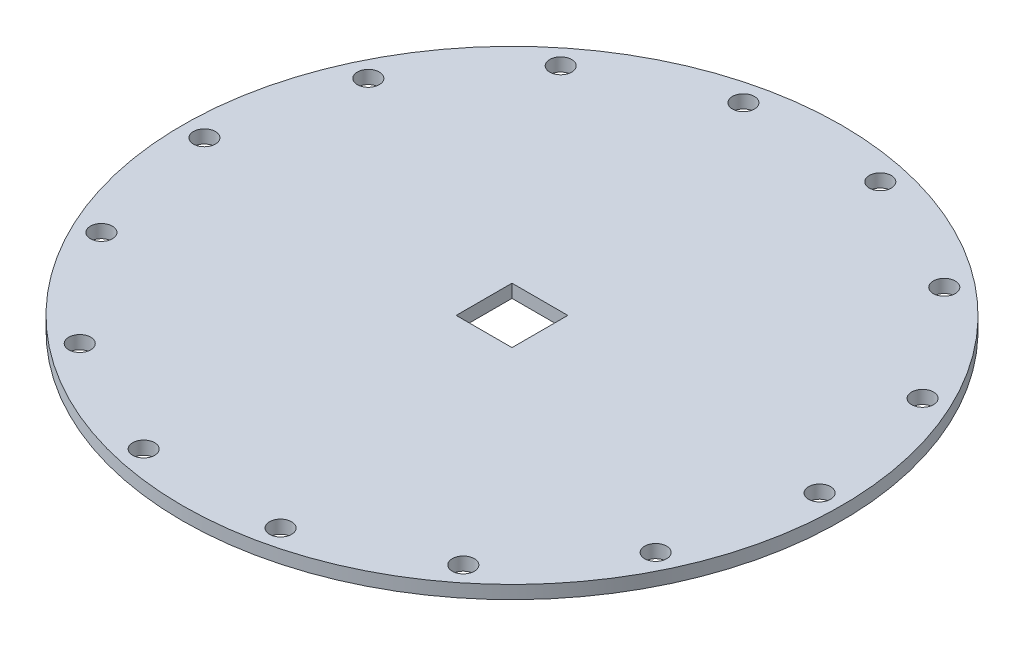
ISO-10303-21;
HEADER;
FILE_DESCRIPTION(('STEP AP214'),'2;1');
FILE_NAME('part.step','',(''),(''),'','','');
FILE_SCHEMA(('AUTOMOTIVE_DESIGN { 1 0 10303 214 1 1 1 1 }'));
ENDSEC;
DATA;
#1=APPLICATION_CONTEXT('core data for automotive mechanical design processes');
#2=APPLICATION_PROTOCOL_DEFINITION('international standard','automotive_design',2000,#1);
#3=PRODUCT_CONTEXT('',#1,'mechanical');
#4=PRODUCT('Part','Part','',(#3));
#5=PRODUCT_RELATED_PRODUCT_CATEGORY('part','',(#4));
#6=PRODUCT_DEFINITION_FORMATION('','',#4);
#7=PRODUCT_DEFINITION_CONTEXT('part definition',#1,'design');
#8=PRODUCT_DEFINITION('design','',#6,#7);
#9=PRODUCT_DEFINITION_SHAPE('','',#8);
#10=(LENGTH_UNIT() NAMED_UNIT(*) SI_UNIT(.MILLI.,.METRE.));
#11=(NAMED_UNIT(*) PLANE_ANGLE_UNIT() SI_UNIT($,.RADIAN.));
#12=(NAMED_UNIT(*) SI_UNIT($,.STERADIAN.) SOLID_ANGLE_UNIT());
#13=UNCERTAINTY_MEASURE_WITH_UNIT(LENGTH_MEASURE(1.E-05),#10,'distance_accuracy_value','');
#14=(GEOMETRIC_REPRESENTATION_CONTEXT(3) GLOBAL_UNCERTAINTY_ASSIGNED_CONTEXT((#13)) GLOBAL_UNIT_ASSIGNED_CONTEXT((#10,
#11,#12)) REPRESENTATION_CONTEXT('',''));
#15=CARTESIAN_POINT('',(0.,0.,0.));
#16=DIRECTION('',(0.,0.,1.));
#17=DIRECTION('',(1.,0.,0.));
#18=AXIS2_PLACEMENT_3D('',#15,#16,#17);
#19=CARTESIAN_POINT('',(0.,6.,0.));
#20=DIRECTION('',(0.,-1.,0.));
#21=DIRECTION('',(0.,0.,-1.));
#22=AXIS2_PLACEMENT_3D('',#19,#20,#21);
#23=CYLINDRICAL_SURFACE('',#22,150.);
#24=CARTESIAN_POINT('',(0.,6.,0.));
#25=DIRECTION('',(0.,1.,0.));
#26=DIRECTION('',(0.,0.,1.));
#27=AXIS2_PLACEMENT_3D('',#24,#25,#26);
#28=CIRCLE('',#27,150.);
#29=CARTESIAN_POINT('',(0.,6.,150.));
#30=VERTEX_POINT('',#29);
#31=EDGE_CURVE('E11',#30,#30,#28,.T.);
#32=ORIENTED_EDGE('',*,*,#31,.F.);
#33=EDGE_LOOP('',(#32));
#34=FACE_BOUND('',#33,.T.);
#35=CARTESIAN_POINT('',(0.,0.,0.));
#36=DIRECTION('',(0.,1.,0.));
#37=DIRECTION('',(0.,0.,1.));
#38=AXIS2_PLACEMENT_3D('',#35,#36,#37);
#39=CIRCLE('',#38,150.);
#40=CARTESIAN_POINT('',(0.,0.,150.));
#41=VERTEX_POINT('',#40);
#42=EDGE_CURVE('E43',#41,#41,#39,.T.);
#43=ORIENTED_EDGE('',*,*,#42,.T.);
#44=EDGE_LOOP('',(#43));
#45=FACE_BOUND('',#44,.T.);
#46=ADVANCED_FACE('F40',(#34,#45),#23,.T.);
#47=CARTESIAN_POINT('',(0.,6.,0.));
#48=DIRECTION('',(0.,1.,0.));
#49=DIRECTION('',(0.,0.,1.));
#50=AXIS2_PLACEMENT_3D('',#47,#48,#49);
#51=PLANE('',#50);
#52=DIRECTION('',(0.,0.,1.));
#53=VECTOR('',#52,1.);
#54=CARTESIAN_POINT('',(12.7,6.,-12.7));
#55=LINE('',#54,#53);
#56=CARTESIAN_POINT('',(12.7,6.,-12.7));
#57=VERTEX_POINT('',#56);
#58=CARTESIAN_POINT('',(12.7,6.,12.7));
#59=VERTEX_POINT('',#58);
#60=EDGE_CURVE('E82',#57,#59,#55,.T.);
#61=ORIENTED_EDGE('',*,*,#60,.T.);
#62=DIRECTION('',(-1.,0.,0.));
#63=VECTOR('',#62,1.);
#64=CARTESIAN_POINT('',(-12.7,6.,12.7));
#65=LINE('',#64,#63);
#66=CARTESIAN_POINT('',(-12.7,6.,12.7));
#67=VERTEX_POINT('',#66);
#68=EDGE_CURVE('E91',#59,#67,#65,.T.);
#69=ORIENTED_EDGE('',*,*,#68,.T.);
#70=DIRECTION('',(0.,0.,-1.));
#71=VECTOR('',#70,1.);
#72=CARTESIAN_POINT('',(-12.7,6.,-12.7));
#73=LINE('',#72,#71);
#74=CARTESIAN_POINT('',(-12.7,6.,-12.7));
#75=VERTEX_POINT('',#74);
#76=EDGE_CURVE('E54',#67,#75,#73,.T.);
#77=ORIENTED_EDGE('',*,*,#76,.T.);
#78=DIRECTION('',(1.,0.,0.));
#79=VECTOR('',#78,1.);
#80=CARTESIAN_POINT('',(-12.7,6.,-12.7));
#81=LINE('',#80,#79);
#82=EDGE_CURVE('E88',#75,#57,#81,.T.);
#83=ORIENTED_EDGE('',*,*,#82,.T.);
#84=EDGE_LOOP('',(#61,#69,#77,#83));
#85=FACE_BOUND('',#84,.T.);
#86=CARTESIAN_POINT('',(140.,6.,0.));
#87=DIRECTION('',(0.,-1.,0.));
#88=DIRECTION('',(0.,0.,-1.));
#89=AXIS2_PLACEMENT_3D('',#86,#87,#88);
#90=CIRCLE('',#89,4.99999999999999);
#91=CARTESIAN_POINT('',(140.,6.,-4.99999999999999));
#92=VERTEX_POINT('',#91);
#93=EDGE_CURVE('E117',#92,#92,#90,.T.);
#94=ORIENTED_EDGE('',*,*,#93,.T.);
#95=EDGE_LOOP('',(#94));
#96=FACE_BOUND('',#95,.T.);
#97=CARTESIAN_POINT('',(126.135641506339,6.,60.7437234764565));
#98=DIRECTION('',(0.,-1.,0.));
#99=DIRECTION('',(0.,0.,-1.));
#100=AXIS2_PLACEMENT_3D('',#97,#98,#99);
#101=CIRCLE('',#100,5.00000000000001);
#102=CARTESIAN_POINT('',(126.135641506339,6.,55.7437234764565));
#103=VERTEX_POINT('',#102);
#104=EDGE_CURVE('E113',#103,#103,#101,.T.);
#105=ORIENTED_EDGE('',*,*,#104,.T.);
#106=EDGE_LOOP('',(#105));
#107=FACE_BOUND('',#106,.T.);
#108=CARTESIAN_POINT('',(87.288572260224,6.,109.456407545523));
#109=DIRECTION('',(0.,-1.,0.));
#110=DIRECTION('',(0.,0.,-1.));
#111=AXIS2_PLACEMENT_3D('',#108,#109,#110);
#112=CIRCLE('',#111,4.99999999999999);
#113=CARTESIAN_POINT('',(87.288572260224,6.,104.456407545523));
#114=VERTEX_POINT('',#113);
#115=EDGE_CURVE('E146',#114,#114,#112,.T.);
#116=ORIENTED_EDGE('',*,*,#115,.T.);
#117=EDGE_LOOP('',(#116));
#118=FACE_BOUND('',#117,.T.);
#119=CARTESIAN_POINT('',(31.1529307538854,6.,136.489907705455));
#120=DIRECTION('',(0.,-1.,0.));
#121=DIRECTION('',(0.,0.,-1.));
#122=AXIS2_PLACEMENT_3D('',#119,#120,#121);
#123=CIRCLE('',#122,4.99999999999998);
#124=CARTESIAN_POINT('',(31.1529307538854,6.,131.489907705455));
#125=VERTEX_POINT('',#124);
#126=EDGE_CURVE('E140',#125,#125,#123,.T.);
#127=ORIENTED_EDGE('',*,*,#126,.T.);
#128=EDGE_LOOP('',(#127));
#129=FACE_BOUND('',#128,.T.);
#130=CARTESIAN_POINT('',(-31.1529307538827,6.,136.489907705456));
#131=DIRECTION('',(0.,-1.,0.));
#132=DIRECTION('',(0.,0.,-1.));
#133=AXIS2_PLACEMENT_3D('',#130,#131,#132);
#134=CIRCLE('',#133,5.);
#135=CARTESIAN_POINT('',(-31.1529307538827,6.,131.489907705456));
#136=VERTEX_POINT('',#135);
#137=EDGE_CURVE('E134',#136,#136,#134,.T.);
#138=ORIENTED_EDGE('',*,*,#137,.T.);
#139=EDGE_LOOP('',(#138));
#140=FACE_BOUND('',#139,.T.);
#141=CARTESIAN_POINT('',(-87.2885722602217,6.,109.456407545525));
#142=DIRECTION('',(0.,-1.,0.));
#143=DIRECTION('',(0.,0.,-1.));
#144=AXIS2_PLACEMENT_3D('',#141,#142,#143);
#145=CIRCLE('',#144,5.);
#146=CARTESIAN_POINT('',(-87.2885722602217,6.,104.456407545525));
#147=VERTEX_POINT('',#146);
#148=EDGE_CURVE('E128',#147,#147,#145,.T.);
#149=ORIENTED_EDGE('',*,*,#148,.T.);
#150=EDGE_LOOP('',(#149));
#151=FACE_BOUND('',#150,.T.);
#152=CARTESIAN_POINT('',(-126.135641506338,6.,60.7437234764591));
#153=DIRECTION('',(0.,-1.,0.));
#154=DIRECTION('',(0.,0.,-1.));
#155=AXIS2_PLACEMENT_3D('',#152,#153,#154);
#156=CIRCLE('',#155,4.99999999999999);
#157=CARTESIAN_POINT('',(-126.135641506338,6.,55.7437234764591));
#158=VERTEX_POINT('',#157);
#159=EDGE_CURVE('E127',#158,#158,#156,.T.);
#160=ORIENTED_EDGE('',*,*,#159,.T.);
#161=EDGE_LOOP('',(#160));
#162=FACE_BOUND('',#161,.T.);
#163=CARTESIAN_POINT('',(-140.,6.,9.77614774876077E-13));
#164=DIRECTION('',(0.,-1.,0.));
#165=DIRECTION('',(0.,0.,-1.));
#166=AXIS2_PLACEMENT_3D('',#163,#164,#165);
#167=CIRCLE('',#166,4.99999999999998);
#168=CARTESIAN_POINT('',(-140.,6.,-4.999999999999));
#169=VERTEX_POINT('',#168);
#170=EDGE_CURVE('E192',#169,#169,#167,.T.);
#171=ORIENTED_EDGE('',*,*,#170,.T.);
#172=EDGE_LOOP('',(#171));
#173=FACE_BOUND('',#172,.T.);
#174=CARTESIAN_POINT('',(-126.135641506339,6.,-60.7437234764574));
#175=DIRECTION('',(0.,-1.,0.));
#176=DIRECTION('',(0.,0.,-1.));
#177=AXIS2_PLACEMENT_3D('',#174,#175,#176);
#178=CIRCLE('',#177,4.99999999999998);
#179=CARTESIAN_POINT('',(-126.135641506339,6.,-65.7437234764574));
#180=VERTEX_POINT('',#179);
#181=EDGE_CURVE('E186',#180,#180,#178,.T.);
#182=ORIENTED_EDGE('',*,*,#181,.T.);
#183=EDGE_LOOP('',(#182));
#184=FACE_BOUND('',#183,.T.);
#185=CARTESIAN_POINT('',(-87.2885722602232,6.,-109.456407545524));
#186=DIRECTION('',(0.,-1.,0.));
#187=DIRECTION('',(0.,0.,-1.));
#188=AXIS2_PLACEMENT_3D('',#185,#186,#187);
#189=CIRCLE('',#188,4.99999999999999);
#190=CARTESIAN_POINT('',(-87.2885722602232,6.,-114.456407545524));
#191=VERTEX_POINT('',#190);
#192=EDGE_CURVE('E180',#191,#191,#189,.T.);
#193=ORIENTED_EDGE('',*,*,#192,.T.);
#194=EDGE_LOOP('',(#193));
#195=FACE_BOUND('',#194,.T.);
#196=CARTESIAN_POINT('',(-31.1529307538846,6.,-136.489907705455));
#197=DIRECTION('',(0.,-1.,0.));
#198=DIRECTION('',(0.,0.,-1.));
#199=AXIS2_PLACEMENT_3D('',#196,#197,#198);
#200=CIRCLE('',#199,4.99999999999998);
#201=CARTESIAN_POINT('',(-31.1529307538846,6.,-141.489907705455));
#202=VERTEX_POINT('',#201);
#203=EDGE_CURVE('E174',#202,#202,#200,.T.);
#204=ORIENTED_EDGE('',*,*,#203,.T.);
#205=EDGE_LOOP('',(#204));
#206=FACE_BOUND('',#205,.T.);
#207=CARTESIAN_POINT('',(31.1529307538836,6.,-136.489907705455));
#208=DIRECTION('',(0.,-1.,0.));
#209=DIRECTION('',(0.,0.,-1.));
#210=AXIS2_PLACEMENT_3D('',#207,#208,#209);
#211=CIRCLE('',#210,4.99999999999999);
#212=CARTESIAN_POINT('',(31.1529307538836,6.,-141.489907705455));
#213=VERTEX_POINT('',#212);
#214=EDGE_CURVE('E168',#213,#213,#211,.T.);
#215=ORIENTED_EDGE('',*,*,#214,.T.);
#216=EDGE_LOOP('',(#215));
#217=FACE_BOUND('',#216,.T.);
#218=CARTESIAN_POINT('',(87.2885722602225,6.,-109.456407545524));
#219=DIRECTION('',(0.,-1.,0.));
#220=DIRECTION('',(0.,0.,-1.));
#221=AXIS2_PLACEMENT_3D('',#218,#219,#220);
#222=CIRCLE('',#221,4.99999999999999);
#223=CARTESIAN_POINT('',(87.2885722602225,6.,-114.456407545524));
#224=VERTEX_POINT('',#223);
#225=EDGE_CURVE('E162',#224,#224,#222,.T.);
#226=ORIENTED_EDGE('',*,*,#225,.T.);
#227=EDGE_LOOP('',(#226));
#228=FACE_BOUND('',#227,.T.);
#229=CARTESIAN_POINT('',(126.135641506339,6.,-60.7437234764583));
#230=DIRECTION('',(0.,-1.,0.));
#231=DIRECTION('',(0.,0.,-1.));
#232=AXIS2_PLACEMENT_3D('',#229,#230,#231);
#233=CIRCLE('',#232,4.99999999999998);
#234=CARTESIAN_POINT('',(126.135641506339,6.,-65.7437234764583));
#235=VERTEX_POINT('',#234);
#236=EDGE_CURVE('E156',#235,#235,#233,.T.);
#237=ORIENTED_EDGE('',*,*,#236,.T.);
#238=EDGE_LOOP('',(#237));
#239=FACE_BOUND('',#238,.T.);
#240=ORIENTED_EDGE('',*,*,#31,.T.);
#241=EDGE_LOOP('',(#240));
#242=FACE_BOUND('',#241,.T.);
#243=ADVANCED_FACE('F95',(#85,#96,#107,#118,#129,#140,#151,#162,#173,#184,#195,#206,#217,#228,
#239,#242),#51,.T.);
#244=CARTESIAN_POINT('',(0.,0.,0.));
#245=DIRECTION('',(0.,1.,0.));
#246=DIRECTION('',(0.,0.,1.));
#247=AXIS2_PLACEMENT_3D('',#244,#245,#246);
#248=PLANE('',#247);
#249=DIRECTION('',(-1.,0.,0.));
#250=VECTOR('',#249,1.);
#251=CARTESIAN_POINT('',(-12.7,0.,12.7));
#252=LINE('',#251,#250);
#253=CARTESIAN_POINT('',(12.7,0.,12.7));
#254=VERTEX_POINT('',#253);
#255=CARTESIAN_POINT('',(-12.7,0.,12.7));
#256=VERTEX_POINT('',#255);
#257=EDGE_CURVE('E107',#254,#256,#252,.T.);
#258=ORIENTED_EDGE('',*,*,#257,.F.);
#259=DIRECTION('',(0.,0.,1.));
#260=VECTOR('',#259,1.);
#261=CARTESIAN_POINT('',(12.7,0.,-12.7));
#262=LINE('',#261,#260);
#263=CARTESIAN_POINT('',(12.7,0.,-12.7));
#264=VERTEX_POINT('',#263);
#265=EDGE_CURVE('E62',#264,#254,#262,.T.);
#266=ORIENTED_EDGE('',*,*,#265,.F.);
#267=DIRECTION('',(1.,0.,0.));
#268=VECTOR('',#267,1.);
#269=CARTESIAN_POINT('',(-12.7,0.,-12.7));
#270=LINE('',#269,#268);
#271=CARTESIAN_POINT('',(-12.7,0.,-12.7));
#272=VERTEX_POINT('',#271);
#273=EDGE_CURVE('E98',#272,#264,#270,.T.);
#274=ORIENTED_EDGE('',*,*,#273,.F.);
#275=DIRECTION('',(0.,0.,-1.));
#276=VECTOR('',#275,1.);
#277=CARTESIAN_POINT('',(-12.7,0.,-12.7));
#278=LINE('',#277,#276);
#279=EDGE_CURVE('E101',#256,#272,#278,.T.);
#280=ORIENTED_EDGE('',*,*,#279,.F.);
#281=EDGE_LOOP('',(#258,#266,#274,#280));
#282=FACE_BOUND('',#281,.T.);
#283=CARTESIAN_POINT('',(140.,0.,0.));
#284=DIRECTION('',(0.,-1.,0.));
#285=DIRECTION('',(0.,0.,-1.));
#286=AXIS2_PLACEMENT_3D('',#283,#284,#285);
#287=CIRCLE('',#286,4.99999999999999);
#288=CARTESIAN_POINT('',(140.,0.,-4.99999999999999));
#289=VERTEX_POINT('',#288);
#290=EDGE_CURVE('E120',#289,#289,#287,.T.);
#291=ORIENTED_EDGE('',*,*,#290,.F.);
#292=EDGE_LOOP('',(#291));
#293=FACE_BOUND('',#292,.T.);
#294=CARTESIAN_POINT('',(126.135641506339,0.,60.7437234764565));
#295=DIRECTION('',(0.,-1.,0.));
#296=DIRECTION('',(0.,0.,-1.));
#297=AXIS2_PLACEMENT_3D('',#294,#295,#296);
#298=CIRCLE('',#297,5.00000000000001);
#299=CARTESIAN_POINT('',(126.135641506339,0.,55.7437234764565));
#300=VERTEX_POINT('',#299);
#301=EDGE_CURVE('E149',#300,#300,#298,.T.);
#302=ORIENTED_EDGE('',*,*,#301,.F.);
#303=EDGE_LOOP('',(#302));
#304=FACE_BOUND('',#303,.T.);
#305=CARTESIAN_POINT('',(87.288572260224,0.,109.456407545523));
#306=DIRECTION('',(0.,-1.,0.));
#307=DIRECTION('',(0.,0.,-1.));
#308=AXIS2_PLACEMENT_3D('',#305,#306,#307);
#309=CIRCLE('',#308,4.99999999999999);
#310=CARTESIAN_POINT('',(87.288572260224,0.,104.456407545523));
#311=VERTEX_POINT('',#310);
#312=EDGE_CURVE('E143',#311,#311,#309,.T.);
#313=ORIENTED_EDGE('',*,*,#312,.F.);
#314=EDGE_LOOP('',(#313));
#315=FACE_BOUND('',#314,.T.);
#316=CARTESIAN_POINT('',(31.1529307538854,0.,136.489907705455));
#317=DIRECTION('',(0.,-1.,0.));
#318=DIRECTION('',(0.,0.,-1.));
#319=AXIS2_PLACEMENT_3D('',#316,#317,#318);
#320=CIRCLE('',#319,4.99999999999998);
#321=CARTESIAN_POINT('',(31.1529307538854,0.,131.489907705455));
#322=VERTEX_POINT('',#321);
#323=EDGE_CURVE('E137',#322,#322,#320,.T.);
#324=ORIENTED_EDGE('',*,*,#323,.F.);
#325=EDGE_LOOP('',(#324));
#326=FACE_BOUND('',#325,.T.);
#327=CARTESIAN_POINT('',(-31.1529307538827,0.,136.489907705456));
#328=DIRECTION('',(0.,-1.,0.));
#329=DIRECTION('',(0.,0.,-1.));
#330=AXIS2_PLACEMENT_3D('',#327,#328,#329);
#331=CIRCLE('',#330,5.);
#332=CARTESIAN_POINT('',(-31.1529307538827,0.,131.489907705456));
#333=VERTEX_POINT('',#332);
#334=EDGE_CURVE('E131',#333,#333,#331,.T.);
#335=ORIENTED_EDGE('',*,*,#334,.F.);
#336=EDGE_LOOP('',(#335));
#337=FACE_BOUND('',#336,.T.);
#338=CARTESIAN_POINT('',(-87.2885722602217,0.,109.456407545525));
#339=DIRECTION('',(0.,-1.,0.));
#340=DIRECTION('',(0.,0.,-1.));
#341=AXIS2_PLACEMENT_3D('',#338,#339,#340);
#342=CIRCLE('',#341,5.);
#343=CARTESIAN_POINT('',(-87.2885722602217,0.,104.456407545525));
#344=VERTEX_POINT('',#343);
#345=EDGE_CURVE('E124',#344,#344,#342,.T.);
#346=ORIENTED_EDGE('',*,*,#345,.F.);
#347=EDGE_LOOP('',(#346));
#348=FACE_BOUND('',#347,.T.);
#349=CARTESIAN_POINT('',(-126.135641506338,0.,60.7437234764591));
#350=DIRECTION('',(0.,-1.,0.));
#351=DIRECTION('',(0.,0.,-1.));
#352=AXIS2_PLACEMENT_3D('',#349,#350,#351);
#353=CIRCLE('',#352,4.99999999999999);
#354=CARTESIAN_POINT('',(-126.135641506338,0.,55.7437234764591));
#355=VERTEX_POINT('',#354);
#356=EDGE_CURVE('E195',#355,#355,#353,.T.);
#357=ORIENTED_EDGE('',*,*,#356,.F.);
#358=EDGE_LOOP('',(#357));
#359=FACE_BOUND('',#358,.T.);
#360=CARTESIAN_POINT('',(-140.,0.,9.77614774876077E-13));
#361=DIRECTION('',(0.,-1.,0.));
#362=DIRECTION('',(0.,0.,-1.));
#363=AXIS2_PLACEMENT_3D('',#360,#361,#362);
#364=CIRCLE('',#363,4.99999999999998);
#365=CARTESIAN_POINT('',(-140.,0.,-4.999999999999));
#366=VERTEX_POINT('',#365);
#367=EDGE_CURVE('E189',#366,#366,#364,.T.);
#368=ORIENTED_EDGE('',*,*,#367,.F.);
#369=EDGE_LOOP('',(#368));
#370=FACE_BOUND('',#369,.T.);
#371=CARTESIAN_POINT('',(-126.135641506339,0.,-60.7437234764574));
#372=DIRECTION('',(0.,-1.,0.));
#373=DIRECTION('',(0.,0.,-1.));
#374=AXIS2_PLACEMENT_3D('',#371,#372,#373);
#375=CIRCLE('',#374,4.99999999999998);
#376=CARTESIAN_POINT('',(-126.135641506339,0.,-65.7437234764574));
#377=VERTEX_POINT('',#376);
#378=EDGE_CURVE('E183',#377,#377,#375,.T.);
#379=ORIENTED_EDGE('',*,*,#378,.F.);
#380=EDGE_LOOP('',(#379));
#381=FACE_BOUND('',#380,.T.);
#382=CARTESIAN_POINT('',(-87.2885722602232,0.,-109.456407545524));
#383=DIRECTION('',(0.,-1.,0.));
#384=DIRECTION('',(0.,0.,-1.));
#385=AXIS2_PLACEMENT_3D('',#382,#383,#384);
#386=CIRCLE('',#385,4.99999999999999);
#387=CARTESIAN_POINT('',(-87.2885722602232,0.,-114.456407545524));
#388=VERTEX_POINT('',#387);
#389=EDGE_CURVE('E177',#388,#388,#386,.T.);
#390=ORIENTED_EDGE('',*,*,#389,.F.);
#391=EDGE_LOOP('',(#390));
#392=FACE_BOUND('',#391,.T.);
#393=CARTESIAN_POINT('',(-31.1529307538846,0.,-136.489907705455));
#394=DIRECTION('',(0.,-1.,0.));
#395=DIRECTION('',(0.,0.,-1.));
#396=AXIS2_PLACEMENT_3D('',#393,#394,#395);
#397=CIRCLE('',#396,4.99999999999998);
#398=CARTESIAN_POINT('',(-31.1529307538846,0.,-141.489907705455));
#399=VERTEX_POINT('',#398);
#400=EDGE_CURVE('E171',#399,#399,#397,.T.);
#401=ORIENTED_EDGE('',*,*,#400,.F.);
#402=EDGE_LOOP('',(#401));
#403=FACE_BOUND('',#402,.T.);
#404=CARTESIAN_POINT('',(31.1529307538836,0.,-136.489907705455));
#405=DIRECTION('',(0.,-1.,0.));
#406=DIRECTION('',(0.,0.,-1.));
#407=AXIS2_PLACEMENT_3D('',#404,#405,#406);
#408=CIRCLE('',#407,4.99999999999999);
#409=CARTESIAN_POINT('',(31.1529307538836,0.,-141.489907705455));
#410=VERTEX_POINT('',#409);
#411=EDGE_CURVE('E165',#410,#410,#408,.T.);
#412=ORIENTED_EDGE('',*,*,#411,.F.);
#413=EDGE_LOOP('',(#412));
#414=FACE_BOUND('',#413,.T.);
#415=CARTESIAN_POINT('',(87.2885722602225,0.,-109.456407545524));
#416=DIRECTION('',(0.,-1.,0.));
#417=DIRECTION('',(0.,0.,-1.));
#418=AXIS2_PLACEMENT_3D('',#415,#416,#417);
#419=CIRCLE('',#418,4.99999999999999);
#420=CARTESIAN_POINT('',(87.2885722602225,0.,-114.456407545524));
#421=VERTEX_POINT('',#420);
#422=EDGE_CURVE('E159',#421,#421,#419,.T.);
#423=ORIENTED_EDGE('',*,*,#422,.F.);
#424=EDGE_LOOP('',(#423));
#425=FACE_BOUND('',#424,.T.);
#426=CARTESIAN_POINT('',(126.135641506339,0.,-60.7437234764583));
#427=DIRECTION('',(0.,-1.,0.));
#428=DIRECTION('',(0.,0.,-1.));
#429=AXIS2_PLACEMENT_3D('',#426,#427,#428);
#430=CIRCLE('',#429,4.99999999999998);
#431=CARTESIAN_POINT('',(126.135641506339,0.,-65.7437234764583));
#432=VERTEX_POINT('',#431);
#433=EDGE_CURVE('E123',#432,#432,#430,.T.);
#434=ORIENTED_EDGE('',*,*,#433,.F.);
#435=EDGE_LOOP('',(#434));
#436=FACE_BOUND('',#435,.T.);
#437=ORIENTED_EDGE('',*,*,#42,.F.);
#438=EDGE_LOOP('',(#437));
#439=FACE_BOUND('',#438,.T.);
#440=ADVANCED_FACE('F211',(#282,#293,#304,#315,#326,#337,#348,#359,#370,#381,#392,#403,#414,
#425,#436,#439),#248,.F.);
#441=CARTESIAN_POINT('',(126.135641506339,6.,-60.7437234764583));
#442=DIRECTION('',(0.,-1.,0.));
#443=DIRECTION('',(0.,0.,-1.));
#444=AXIS2_PLACEMENT_3D('',#441,#442,#443);
#445=CYLINDRICAL_SURFACE('',#444,4.99999999999998);
#446=ORIENTED_EDGE('',*,*,#236,.F.);
#447=EDGE_LOOP('',(#446));
#448=FACE_BOUND('',#447,.T.);
#449=ORIENTED_EDGE('',*,*,#433,.T.);
#450=EDGE_LOOP('',(#449));
#451=FACE_BOUND('',#450,.T.);
#452=ADVANCED_FACE('F214',(#448,#451),#445,.F.);
#453=CARTESIAN_POINT('',(87.2885722602225,6.,-109.456407545524));
#454=DIRECTION('',(0.,-1.,0.));
#455=DIRECTION('',(0.,0.,-1.));
#456=AXIS2_PLACEMENT_3D('',#453,#454,#455);
#457=CYLINDRICAL_SURFACE('',#456,4.99999999999999);
#458=ORIENTED_EDGE('',*,*,#225,.F.);
#459=EDGE_LOOP('',(#458));
#460=FACE_BOUND('',#459,.T.);
#461=ORIENTED_EDGE('',*,*,#422,.T.);
#462=EDGE_LOOP('',(#461));
#463=FACE_BOUND('',#462,.T.);
#464=ADVANCED_FACE('F262',(#460,#463),#457,.F.);
#465=CARTESIAN_POINT('',(31.1529307538836,6.,-136.489907705455));
#466=DIRECTION('',(0.,-1.,0.));
#467=DIRECTION('',(0.,0.,-1.));
#468=AXIS2_PLACEMENT_3D('',#465,#466,#467);
#469=CYLINDRICAL_SURFACE('',#468,4.99999999999999);
#470=ORIENTED_EDGE('',*,*,#214,.F.);
#471=EDGE_LOOP('',(#470));
#472=FACE_BOUND('',#471,.T.);
#473=ORIENTED_EDGE('',*,*,#411,.T.);
#474=EDGE_LOOP('',(#473));
#475=FACE_BOUND('',#474,.T.);
#476=ADVANCED_FACE('F258',(#472,#475),#469,.F.);
#477=CARTESIAN_POINT('',(-31.1529307538846,6.,-136.489907705455));
#478=DIRECTION('',(0.,-1.,0.));
#479=DIRECTION('',(0.,0.,-1.));
#480=AXIS2_PLACEMENT_3D('',#477,#478,#479);
#481=CYLINDRICAL_SURFACE('',#480,4.99999999999998);
#482=ORIENTED_EDGE('',*,*,#203,.F.);
#483=EDGE_LOOP('',(#482));
#484=FACE_BOUND('',#483,.T.);
#485=ORIENTED_EDGE('',*,*,#400,.T.);
#486=EDGE_LOOP('',(#485));
#487=FACE_BOUND('',#486,.T.);
#488=ADVANCED_FACE('F254',(#484,#487),#481,.F.);
#489=CARTESIAN_POINT('',(-87.2885722602232,6.,-109.456407545524));
#490=DIRECTION('',(0.,-1.,0.));
#491=DIRECTION('',(0.,0.,-1.));
#492=AXIS2_PLACEMENT_3D('',#489,#490,#491);
#493=CYLINDRICAL_SURFACE('',#492,4.99999999999999);
#494=ORIENTED_EDGE('',*,*,#192,.F.);
#495=EDGE_LOOP('',(#494));
#496=FACE_BOUND('',#495,.T.);
#497=ORIENTED_EDGE('',*,*,#389,.T.);
#498=EDGE_LOOP('',(#497));
#499=FACE_BOUND('',#498,.T.);
#500=ADVANCED_FACE('F250',(#496,#499),#493,.F.);
#501=CARTESIAN_POINT('',(-126.135641506339,6.,-60.7437234764574));
#502=DIRECTION('',(0.,-1.,0.));
#503=DIRECTION('',(0.,0.,-1.));
#504=AXIS2_PLACEMENT_3D('',#501,#502,#503);
#505=CYLINDRICAL_SURFACE('',#504,4.99999999999998);
#506=ORIENTED_EDGE('',*,*,#181,.F.);
#507=EDGE_LOOP('',(#506));
#508=FACE_BOUND('',#507,.T.);
#509=ORIENTED_EDGE('',*,*,#378,.T.);
#510=EDGE_LOOP('',(#509));
#511=FACE_BOUND('',#510,.T.);
#512=ADVANCED_FACE('F246',(#508,#511),#505,.F.);
#513=CARTESIAN_POINT('',(-140.,6.,9.77614774876077E-13));
#514=DIRECTION('',(0.,-1.,0.));
#515=DIRECTION('',(0.,0.,-1.));
#516=AXIS2_PLACEMENT_3D('',#513,#514,#515);
#517=CYLINDRICAL_SURFACE('',#516,4.99999999999998);
#518=ORIENTED_EDGE('',*,*,#170,.F.);
#519=EDGE_LOOP('',(#518));
#520=FACE_BOUND('',#519,.T.);
#521=ORIENTED_EDGE('',*,*,#367,.T.);
#522=EDGE_LOOP('',(#521));
#523=FACE_BOUND('',#522,.T.);
#524=ADVANCED_FACE('F207',(#520,#523),#517,.F.);
#525=CARTESIAN_POINT('',(-126.135641506338,6.,60.7437234764591));
#526=DIRECTION('',(0.,-1.,0.));
#527=DIRECTION('',(0.,0.,-1.));
#528=AXIS2_PLACEMENT_3D('',#525,#526,#527);
#529=CYLINDRICAL_SURFACE('',#528,4.99999999999999);
#530=ORIENTED_EDGE('',*,*,#159,.F.);
#531=EDGE_LOOP('',(#530));
#532=FACE_BOUND('',#531,.T.);
#533=ORIENTED_EDGE('',*,*,#356,.T.);
#534=EDGE_LOOP('',(#533));
#535=FACE_BOUND('',#534,.T.);
#536=ADVANCED_FACE('F203',(#532,#535),#529,.F.);
#537=CARTESIAN_POINT('',(-87.2885722602217,6.,109.456407545525));
#538=DIRECTION('',(0.,-1.,0.));
#539=DIRECTION('',(0.,0.,-1.));
#540=AXIS2_PLACEMENT_3D('',#537,#538,#539);
#541=CYLINDRICAL_SURFACE('',#540,5.);
#542=ORIENTED_EDGE('',*,*,#148,.F.);
#543=EDGE_LOOP('',(#542));
#544=FACE_BOUND('',#543,.T.);
#545=ORIENTED_EDGE('',*,*,#345,.T.);
#546=EDGE_LOOP('',(#545));
#547=FACE_BOUND('',#546,.T.);
#548=ADVANCED_FACE('F206',(#544,#547),#541,.F.);
#549=CARTESIAN_POINT('',(-31.1529307538827,6.,136.489907705456));
#550=DIRECTION('',(0.,-1.,0.));
#551=DIRECTION('',(0.,0.,-1.));
#552=AXIS2_PLACEMENT_3D('',#549,#550,#551);
#553=CYLINDRICAL_SURFACE('',#552,5.);
#554=ORIENTED_EDGE('',*,*,#137,.F.);
#555=EDGE_LOOP('',(#554));
#556=FACE_BOUND('',#555,.T.);
#557=ORIENTED_EDGE('',*,*,#334,.T.);
#558=EDGE_LOOP('',(#557));
#559=FACE_BOUND('',#558,.T.);
#560=ADVANCED_FACE('F282',(#556,#559),#553,.F.);
#561=CARTESIAN_POINT('',(31.1529307538854,6.,136.489907705455));
#562=DIRECTION('',(0.,-1.,0.));
#563=DIRECTION('',(0.,0.,-1.));
#564=AXIS2_PLACEMENT_3D('',#561,#562,#563);
#565=CYLINDRICAL_SURFACE('',#564,4.99999999999998);
#566=ORIENTED_EDGE('',*,*,#126,.F.);
#567=EDGE_LOOP('',(#566));
#568=FACE_BOUND('',#567,.T.);
#569=ORIENTED_EDGE('',*,*,#323,.T.);
#570=EDGE_LOOP('',(#569));
#571=FACE_BOUND('',#570,.T.);
#572=ADVANCED_FACE('F278',(#568,#571),#565,.F.);
#573=CARTESIAN_POINT('',(87.288572260224,6.,109.456407545523));
#574=DIRECTION('',(0.,-1.,0.));
#575=DIRECTION('',(0.,0.,-1.));
#576=AXIS2_PLACEMENT_3D('',#573,#574,#575);
#577=CYLINDRICAL_SURFACE('',#576,4.99999999999999);
#578=ORIENTED_EDGE('',*,*,#115,.F.);
#579=EDGE_LOOP('',(#578));
#580=FACE_BOUND('',#579,.T.);
#581=ORIENTED_EDGE('',*,*,#312,.T.);
#582=EDGE_LOOP('',(#581));
#583=FACE_BOUND('',#582,.T.);
#584=ADVANCED_FACE('F274',(#580,#583),#577,.F.);
#585=CARTESIAN_POINT('',(126.135641506339,6.,60.7437234764565));
#586=DIRECTION('',(0.,-1.,0.));
#587=DIRECTION('',(0.,0.,-1.));
#588=AXIS2_PLACEMENT_3D('',#585,#586,#587);
#589=CYLINDRICAL_SURFACE('',#588,5.00000000000001);
#590=ORIENTED_EDGE('',*,*,#104,.F.);
#591=EDGE_LOOP('',(#590));
#592=FACE_BOUND('',#591,.T.);
#593=ORIENTED_EDGE('',*,*,#301,.T.);
#594=EDGE_LOOP('',(#593));
#595=FACE_BOUND('',#594,.T.);
#596=ADVANCED_FACE('F270',(#592,#595),#589,.F.);
#597=CARTESIAN_POINT('',(140.,6.,0.));
#598=DIRECTION('',(0.,-1.,0.));
#599=DIRECTION('',(0.,0.,-1.));
#600=AXIS2_PLACEMENT_3D('',#597,#598,#599);
#601=CYLINDRICAL_SURFACE('',#600,4.99999999999999);
#602=ORIENTED_EDGE('',*,*,#93,.F.);
#603=EDGE_LOOP('',(#602));
#604=FACE_BOUND('',#603,.T.);
#605=ORIENTED_EDGE('',*,*,#290,.T.);
#606=EDGE_LOOP('',(#605));
#607=FACE_BOUND('',#606,.T.);
#608=ADVANCED_FACE('F273',(#604,#607),#601,.F.);
#609=CARTESIAN_POINT('',(12.7,6.,-12.7));
#610=DIRECTION('',(1.,0.,0.));
#611=DIRECTION('',(0.,0.,-1.));
#612=AXIS2_PLACEMENT_3D('',#609,#610,#611);
#613=PLANE('',#612);
#614=ORIENTED_EDGE('',*,*,#265,.T.);
#615=DIRECTION('',(0.,-1.,0.));
#616=VECTOR('',#615,1.);
#617=CARTESIAN_POINT('',(12.7,6.,12.7));
#618=LINE('',#617,#616);
#619=EDGE_CURVE('E78',#59,#254,#618,.T.);
#620=ORIENTED_EDGE('',*,*,#619,.F.);
#621=ORIENTED_EDGE('',*,*,#60,.F.);
#622=DIRECTION('',(0.,-1.,0.));
#623=VECTOR('',#622,1.);
#624=CARTESIAN_POINT('',(12.7,6.,-12.7));
#625=LINE('',#624,#623);
#626=EDGE_CURVE('E111',#57,#264,#625,.T.);
#627=ORIENTED_EDGE('',*,*,#626,.T.);
#628=EDGE_LOOP('',(#614,#620,#621,#627));
#629=FACE_BOUND('',#628,.T.);
#630=ADVANCED_FACE('F80',(#629),#613,.F.);
#631=CARTESIAN_POINT('',(-12.7,6.,-12.7));
#632=DIRECTION('',(0.,0.,-1.));
#633=DIRECTION('',(-1.,0.,0.));
#634=AXIS2_PLACEMENT_3D('',#631,#632,#633);
#635=PLANE('',#634);
#636=ORIENTED_EDGE('',*,*,#273,.T.);
#637=ORIENTED_EDGE('',*,*,#626,.F.);
#638=ORIENTED_EDGE('',*,*,#82,.F.);
#639=DIRECTION('',(0.,-1.,0.));
#640=VECTOR('',#639,1.);
#641=CARTESIAN_POINT('',(-12.7,6.,-12.7));
#642=LINE('',#641,#640);
#643=EDGE_CURVE('E114',#75,#272,#642,.T.);
#644=ORIENTED_EDGE('',*,*,#643,.T.);
#645=EDGE_LOOP('',(#636,#637,#638,#644));
#646=FACE_BOUND('',#645,.T.);
#647=ADVANCED_FACE('F295',(#646),#635,.F.);
#648=CARTESIAN_POINT('',(-12.7,6.,-12.7));
#649=DIRECTION('',(-1.,0.,0.));
#650=DIRECTION('',(0.,0.,1.));
#651=AXIS2_PLACEMENT_3D('',#648,#649,#650);
#652=PLANE('',#651);
#653=ORIENTED_EDGE('',*,*,#279,.T.);
#654=ORIENTED_EDGE('',*,*,#643,.F.);
#655=ORIENTED_EDGE('',*,*,#76,.F.);
#656=DIRECTION('',(0.,-1.,0.));
#657=VECTOR('',#656,1.);
#658=CARTESIAN_POINT('',(-12.7,6.,12.7));
#659=LINE('',#658,#657);
#660=EDGE_CURVE('E87',#67,#256,#659,.T.);
#661=ORIENTED_EDGE('',*,*,#660,.T.);
#662=EDGE_LOOP('',(#653,#654,#655,#661));
#663=FACE_BOUND('',#662,.T.);
#664=ADVANCED_FACE('F298',(#663),#652,.F.);
#665=CARTESIAN_POINT('',(-12.7,6.,12.7));
#666=DIRECTION('',(0.,0.,1.));
#667=DIRECTION('',(1.,0.,0.));
#668=AXIS2_PLACEMENT_3D('',#665,#666,#667);
#669=PLANE('',#668);
#670=ORIENTED_EDGE('',*,*,#257,.T.);
#671=ORIENTED_EDGE('',*,*,#660,.F.);
#672=ORIENTED_EDGE('',*,*,#68,.F.);
#673=ORIENTED_EDGE('',*,*,#619,.T.);
#674=EDGE_LOOP('',(#670,#671,#672,#673));
#675=FACE_BOUND('',#674,.T.);
#676=ADVANCED_FACE('F92',(#675),#669,.F.);
#677=CLOSED_SHELL('',(#46,#243,#440,#452,#464,#476,#488,#500,#512,#524,#536,#548,#560,#572,#584,
#596,#608,#630,#647,#664,#676));
#678=MANIFOLD_SOLID_BREP('B2',#677);
#679=ADVANCED_BREP_SHAPE_REPRESENTATION('',(#18,#678),#14);
#680=SHAPE_DEFINITION_REPRESENTATION(#9,#679);
ENDSEC;
END-ISO-10303-21;
